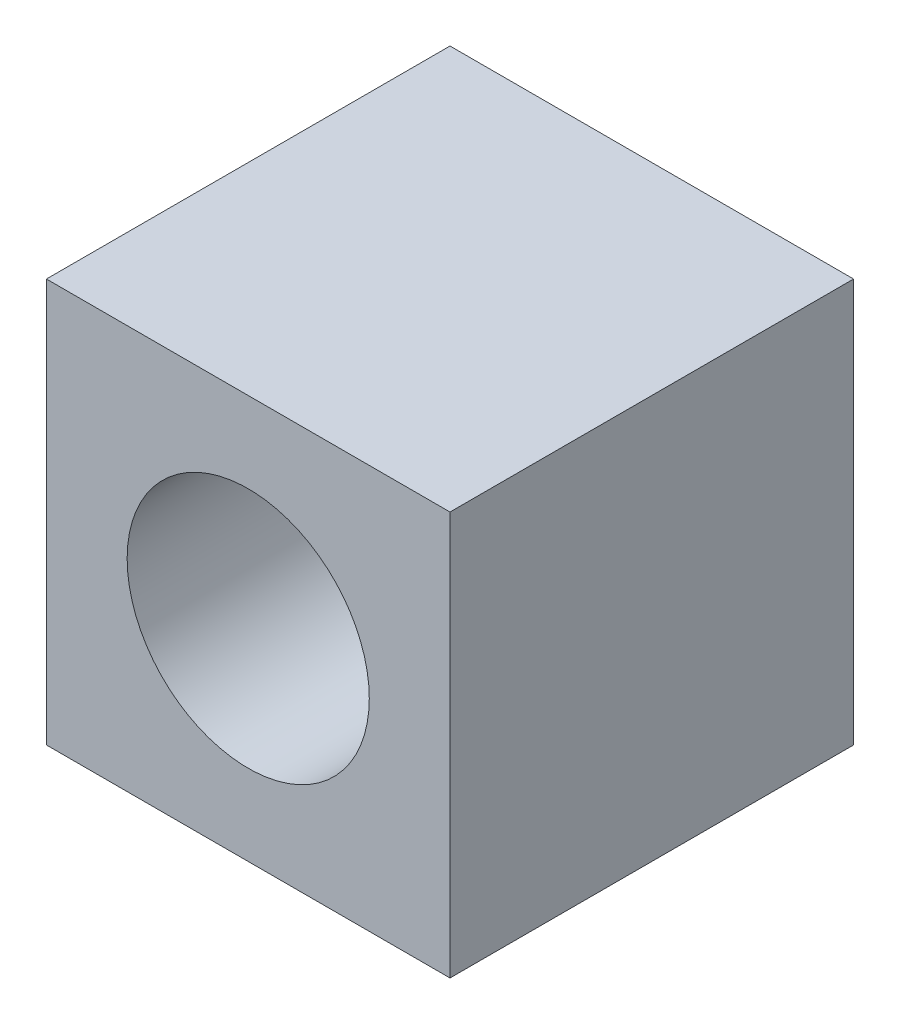
ISO-10303-21;
HEADER;
FILE_DESCRIPTION(('STEP AP214'),'2;1');
FILE_NAME('part.step','',(''),(''),'','','');
FILE_SCHEMA(('AUTOMOTIVE_DESIGN { 1 0 10303 214 1 1 1 1 }'));
ENDSEC;
DATA;
#1=APPLICATION_CONTEXT('core data for automotive mechanical design processes');
#2=APPLICATION_PROTOCOL_DEFINITION('international standard','automotive_design',2000,#1);
#3=PRODUCT_CONTEXT('',#1,'mechanical');
#4=PRODUCT('Part','Part','',(#3));
#5=PRODUCT_RELATED_PRODUCT_CATEGORY('part','',(#4));
#6=PRODUCT_DEFINITION_FORMATION('','',#4);
#7=PRODUCT_DEFINITION_CONTEXT('part definition',#1,'design');
#8=PRODUCT_DEFINITION('design','',#6,#7);
#9=PRODUCT_DEFINITION_SHAPE('','',#8);
#10=(LENGTH_UNIT() NAMED_UNIT(*) SI_UNIT(.MILLI.,.METRE.));
#11=(NAMED_UNIT(*) PLANE_ANGLE_UNIT() SI_UNIT($,.RADIAN.));
#12=(NAMED_UNIT(*) SI_UNIT($,.STERADIAN.) SOLID_ANGLE_UNIT());
#13=UNCERTAINTY_MEASURE_WITH_UNIT(LENGTH_MEASURE(1.E-05),#10,'distance_accuracy_value','');
#14=(GEOMETRIC_REPRESENTATION_CONTEXT(3) GLOBAL_UNCERTAINTY_ASSIGNED_CONTEXT((#13)) GLOBAL_UNIT_ASSIGNED_CONTEXT((#10,
#11,#12)) REPRESENTATION_CONTEXT('',''));
#15=CARTESIAN_POINT('',(0.,0.,0.));
#16=DIRECTION('',(0.,0.,1.));
#17=DIRECTION('',(1.,0.,0.));
#18=AXIS2_PLACEMENT_3D('',#15,#16,#17);
#19=CARTESIAN_POINT('',(0.,0.,10.));
#20=DIRECTION('',(1.,0.,0.));
#21=DIRECTION('',(0.,0.,-1.));
#22=AXIS2_PLACEMENT_3D('',#19,#20,#21);
#23=PLANE('',#22);
#24=DIRECTION('',(0.,-1.,0.));
#25=VECTOR('',#24,1.);
#26=CARTESIAN_POINT('',(0.,0.,0.));
#27=LINE('',#26,#25);
#28=CARTESIAN_POINT('',(0.,10.,0.));
#29=VERTEX_POINT('',#28);
#30=CARTESIAN_POINT('',(0.,0.,0.));
#31=VERTEX_POINT('',#30);
#32=EDGE_CURVE('E106',#29,#31,#27,.T.);
#33=ORIENTED_EDGE('',*,*,#32,.T.);
#34=DIRECTION('',(0.,0.,-1.));
#35=VECTOR('',#34,1.);
#36=CARTESIAN_POINT('',(0.,0.,10.));
#37=LINE('',#36,#35);
#38=CARTESIAN_POINT('',(0.,0.,10.));
#39=VERTEX_POINT('',#38);
#40=EDGE_CURVE('E11',#39,#31,#37,.T.);
#41=ORIENTED_EDGE('',*,*,#40,.F.);
#42=DIRECTION('',(0.,-1.,0.));
#43=VECTOR('',#42,1.);
#44=CARTESIAN_POINT('',(0.,0.,10.));
#45=LINE('',#44,#43);
#46=CARTESIAN_POINT('',(0.,10.,10.));
#47=VERTEX_POINT('',#46);
#48=EDGE_CURVE('E94',#47,#39,#45,.T.);
#49=ORIENTED_EDGE('',*,*,#48,.F.);
#50=DIRECTION('',(0.,0.,-1.));
#51=VECTOR('',#50,1.);
#52=CARTESIAN_POINT('',(0.,10.,10.));
#53=LINE('',#52,#51);
#54=EDGE_CURVE('E105',#47,#29,#53,.T.);
#55=ORIENTED_EDGE('',*,*,#54,.T.);
#56=EDGE_LOOP('',(#33,#41,#49,#55));
#57=FACE_BOUND('',#56,.T.);
#58=ADVANCED_FACE('F43',(#57),#23,.F.);
#59=CARTESIAN_POINT('',(0.,0.,10.));
#60=DIRECTION('',(0.,1.,0.));
#61=DIRECTION('',(0.,0.,1.));
#62=AXIS2_PLACEMENT_3D('',#59,#60,#61);
#63=PLANE('',#62);
#64=DIRECTION('',(1.,0.,0.));
#65=VECTOR('',#64,1.);
#66=CARTESIAN_POINT('',(0.,0.,0.));
#67=LINE('',#66,#65);
#68=CARTESIAN_POINT('',(10.,0.,0.));
#69=VERTEX_POINT('',#68);
#70=EDGE_CURVE('E98',#31,#69,#67,.T.);
#71=ORIENTED_EDGE('',*,*,#70,.T.);
#72=DIRECTION('',(0.,0.,-1.));
#73=VECTOR('',#72,1.);
#74=CARTESIAN_POINT('',(10.,0.,10.));
#75=LINE('',#74,#73);
#76=CARTESIAN_POINT('',(10.,0.,10.));
#77=VERTEX_POINT('',#76);
#78=EDGE_CURVE('E51',#77,#69,#75,.T.);
#79=ORIENTED_EDGE('',*,*,#78,.F.);
#80=DIRECTION('',(1.,0.,0.));
#81=VECTOR('',#80,1.);
#82=CARTESIAN_POINT('',(0.,0.,10.));
#83=LINE('',#82,#81);
#84=EDGE_CURVE('E90',#39,#77,#83,.T.);
#85=ORIENTED_EDGE('',*,*,#84,.F.);
#86=ORIENTED_EDGE('',*,*,#40,.T.);
#87=EDGE_LOOP('',(#71,#79,#85,#86));
#88=FACE_BOUND('',#87,.T.);
#89=ADVANCED_FACE('F100',(#88),#63,.F.);
#90=CARTESIAN_POINT('',(10.,0.,10.));
#91=DIRECTION('',(-1.,0.,0.));
#92=DIRECTION('',(0.,0.,1.));
#93=AXIS2_PLACEMENT_3D('',#90,#91,#92);
#94=PLANE('',#93);
#95=DIRECTION('',(0.,1.,0.));
#96=VECTOR('',#95,1.);
#97=CARTESIAN_POINT('',(10.,0.,0.));
#98=LINE('',#97,#96);
#99=CARTESIAN_POINT('',(10.,10.,0.));
#100=VERTEX_POINT('',#99);
#101=EDGE_CURVE('E78',#69,#100,#98,.T.);
#102=ORIENTED_EDGE('',*,*,#101,.T.);
#103=DIRECTION('',(0.,0.,-1.));
#104=VECTOR('',#103,1.);
#105=CARTESIAN_POINT('',(10.,10.,10.));
#106=LINE('',#105,#104);
#107=CARTESIAN_POINT('',(10.,10.,10.));
#108=VERTEX_POINT('',#107);
#109=EDGE_CURVE('E97',#108,#100,#106,.T.);
#110=ORIENTED_EDGE('',*,*,#109,.F.);
#111=DIRECTION('',(0.,1.,0.));
#112=VECTOR('',#111,1.);
#113=CARTESIAN_POINT('',(10.,0.,10.));
#114=LINE('',#113,#112);
#115=EDGE_CURVE('E95',#77,#108,#114,.T.);
#116=ORIENTED_EDGE('',*,*,#115,.F.);
#117=ORIENTED_EDGE('',*,*,#78,.T.);
#118=EDGE_LOOP('',(#102,#110,#116,#117));
#119=FACE_BOUND('',#118,.T.);
#120=ADVANCED_FACE('F99',(#119),#94,.F.);
#121=CARTESIAN_POINT('',(0.,10.,10.));
#122=DIRECTION('',(0.,-1.,0.));
#123=DIRECTION('',(0.,0.,-1.));
#124=AXIS2_PLACEMENT_3D('',#121,#122,#123);
#125=PLANE('',#124);
#126=DIRECTION('',(-1.,0.,0.));
#127=VECTOR('',#126,1.);
#128=CARTESIAN_POINT('',(0.,10.,0.));
#129=LINE('',#128,#127);
#130=EDGE_CURVE('E84',#100,#29,#129,.T.);
#131=ORIENTED_EDGE('',*,*,#130,.T.);
#132=ORIENTED_EDGE('',*,*,#54,.F.);
#133=DIRECTION('',(-1.,0.,0.));
#134=VECTOR('',#133,1.);
#135=CARTESIAN_POINT('',(0.,10.,10.));
#136=LINE('',#135,#134);
#137=EDGE_CURVE('E56',#108,#47,#136,.T.);
#138=ORIENTED_EDGE('',*,*,#137,.F.);
#139=ORIENTED_EDGE('',*,*,#109,.T.);
#140=EDGE_LOOP('',(#131,#132,#138,#139));
#141=FACE_BOUND('',#140,.T.);
#142=ADVANCED_FACE('F111',(#141),#125,.F.);
#143=CARTESIAN_POINT('',(0.,0.,10.));
#144=DIRECTION('',(0.,0.,-1.));
#145=DIRECTION('',(-1.,0.,0.));
#146=AXIS2_PLACEMENT_3D('',#143,#144,#145);
#147=PLANE('',#146);
#148=CARTESIAN_POINT('',(5.,5.,10.));
#149=DIRECTION('',(0.,0.,1.));
#150=DIRECTION('',(1.,0.,0.));
#151=AXIS2_PLACEMENT_3D('',#148,#149,#150);
#152=CIRCLE('',#151,3.);
#153=CARTESIAN_POINT('',(8.,5.,10.));
#154=VERTEX_POINT('',#153);
#155=EDGE_CURVE('E116',#154,#154,#152,.T.);
#156=ORIENTED_EDGE('',*,*,#155,.F.);
#157=EDGE_LOOP('',(#156));
#158=FACE_BOUND('',#157,.T.);
#159=ORIENTED_EDGE('',*,*,#48,.T.);
#160=ORIENTED_EDGE('',*,*,#84,.T.);
#161=ORIENTED_EDGE('',*,*,#115,.T.);
#162=ORIENTED_EDGE('',*,*,#137,.T.);
#163=EDGE_LOOP('',(#159,#160,#161,#162));
#164=FACE_BOUND('',#163,.T.);
#165=ADVANCED_FACE('F89',(#158,#164),#147,.F.);
#166=CARTESIAN_POINT('',(0.,0.,0.));
#167=DIRECTION('',(0.,0.,-1.));
#168=DIRECTION('',(-1.,0.,0.));
#169=AXIS2_PLACEMENT_3D('',#166,#167,#168);
#170=PLANE('',#169);
#171=ORIENTED_EDGE('',*,*,#32,.F.);
#172=ORIENTED_EDGE('',*,*,#130,.F.);
#173=ORIENTED_EDGE('',*,*,#101,.F.);
#174=ORIENTED_EDGE('',*,*,#70,.F.);
#175=EDGE_LOOP('',(#171,#172,#173,#174));
#176=FACE_BOUND('',#175,.T.);
#177=ADVANCED_FACE('F119',(#176),#170,.T.);
#178=CARTESIAN_POINT('',(5.,5.,5.));
#179=DIRECTION('',(0.,0.,1.));
#180=DIRECTION('',(1.,0.,0.));
#181=AXIS2_PLACEMENT_3D('',#178,#179,#180);
#182=CYLINDRICAL_SURFACE('',#181,3.);
#183=CARTESIAN_POINT('',(5.,5.,5.));
#184=DIRECTION('',(0.,0.,1.));
#185=DIRECTION('',(1.,0.,0.));
#186=AXIS2_PLACEMENT_3D('',#183,#184,#185);
#187=CIRCLE('',#186,3.);
#188=CARTESIAN_POINT('',(8.,5.,5.));
#189=VERTEX_POINT('',#188);
#190=EDGE_CURVE('E108',#189,#189,#187,.T.);
#191=ORIENTED_EDGE('',*,*,#190,.F.);
#192=EDGE_LOOP('',(#191));
#193=FACE_BOUND('',#192,.T.);
#194=ORIENTED_EDGE('',*,*,#155,.T.);
#195=EDGE_LOOP('',(#194));
#196=FACE_BOUND('',#195,.T.);
#197=ADVANCED_FACE('F126',(#193,#196),#182,.F.);
#198=CARTESIAN_POINT('',(5.,5.,5.));
#199=DIRECTION('',(0.,0.,1.));
#200=DIRECTION('',(1.,0.,0.));
#201=AXIS2_PLACEMENT_3D('',#198,#199,#200);
#202=PLANE('',#201);
#203=ORIENTED_EDGE('',*,*,#190,.T.);
#204=EDGE_LOOP('',(#203));
#205=FACE_BOUND('',#204,.T.);
#206=ADVANCED_FACE('F127',(#205),#202,.T.);
#207=CLOSED_SHELL('',(#58,#89,#120,#142,#165,#177,#197,#206));
#208=MANIFOLD_SOLID_BREP('B2',#207);
#209=ADVANCED_BREP_SHAPE_REPRESENTATION('',(#18,#208),#14);
#210=SHAPE_DEFINITION_REPRESENTATION(#9,#209);
ENDSEC;
END-ISO-10303-21;
